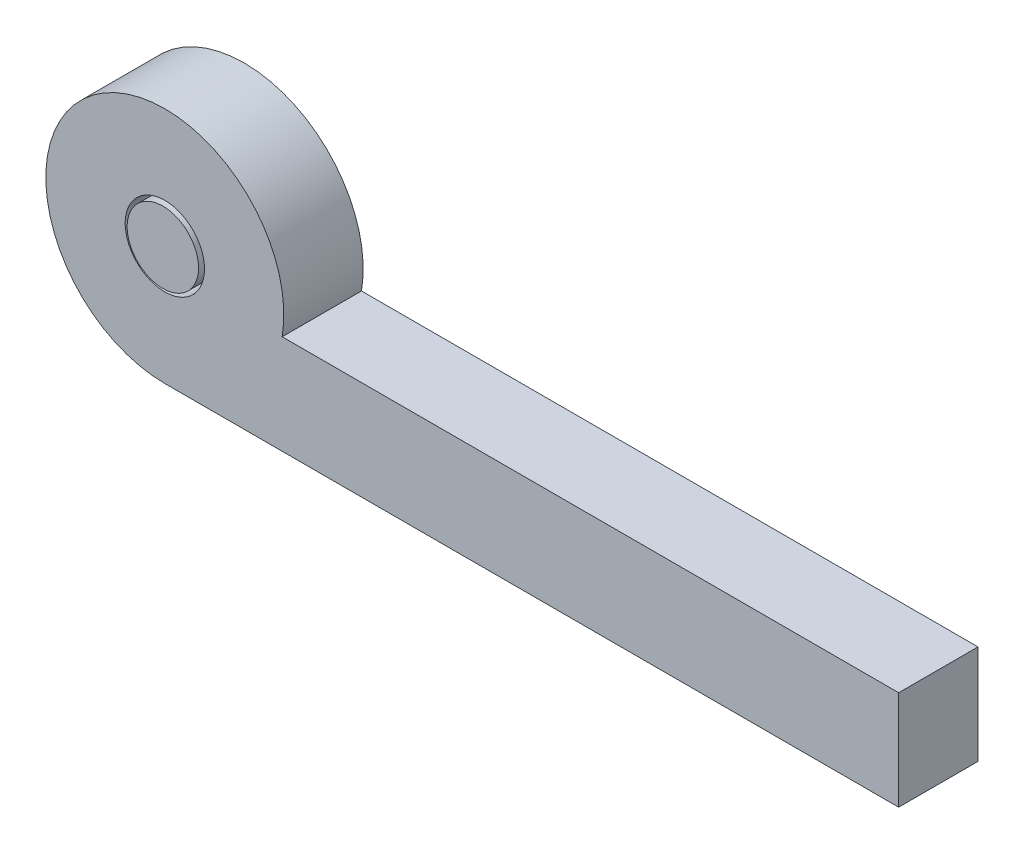
ISO-10303-21;
HEADER;
FILE_DESCRIPTION(('STEP AP214'),'2;1');
FILE_NAME('part.step','',(''),(''),'','','');
FILE_SCHEMA(('AUTOMOTIVE_DESIGN { 1 0 10303 214 1 1 1 1 }'));
ENDSEC;
DATA;
#1=APPLICATION_CONTEXT('core data for automotive mechanical design processes');
#2=APPLICATION_PROTOCOL_DEFINITION('international standard','automotive_design',2000,#1);
#3=PRODUCT_CONTEXT('',#1,'mechanical');
#4=PRODUCT('Part','Part','',(#3));
#5=PRODUCT_RELATED_PRODUCT_CATEGORY('part','',(#4));
#6=PRODUCT_DEFINITION_FORMATION('','',#4);
#7=PRODUCT_DEFINITION_CONTEXT('part definition',#1,'design');
#8=PRODUCT_DEFINITION('design','',#6,#7);
#9=PRODUCT_DEFINITION_SHAPE('','',#8);
#10=(LENGTH_UNIT() NAMED_UNIT(*) SI_UNIT(.MILLI.,.METRE.));
#11=(NAMED_UNIT(*) PLANE_ANGLE_UNIT() SI_UNIT($,.RADIAN.));
#12=(NAMED_UNIT(*) SI_UNIT($,.STERADIAN.) SOLID_ANGLE_UNIT());
#13=UNCERTAINTY_MEASURE_WITH_UNIT(LENGTH_MEASURE(1.E-05),#10,'distance_accuracy_value','');
#14=(GEOMETRIC_REPRESENTATION_CONTEXT(3) GLOBAL_UNCERTAINTY_ASSIGNED_CONTEXT((#13)) GLOBAL_UNIT_ASSIGNED_CONTEXT((#10,
#11,#12)) REPRESENTATION_CONTEXT('',''));
#15=CARTESIAN_POINT('',(0.,0.,0.));
#16=DIRECTION('',(0.,0.,1.));
#17=DIRECTION('',(1.,0.,0.));
#18=AXIS2_PLACEMENT_3D('',#15,#16,#17);
#19=CARTESIAN_POINT('',(-73.025,-41.275,-6.6675));
#20=DIRECTION('',(0.,0.,1.));
#21=DIRECTION('',(1.,0.,0.));
#22=AXIS2_PLACEMENT_3D('',#19,#20,#21);
#23=CYLINDRICAL_SURFACE('',#22,5.71499999999999);
#24=CARTESIAN_POINT('',(-73.025,-41.275,-6.6675));
#25=DIRECTION('',(0.,0.,1.));
#26=DIRECTION('',(1.,0.,0.));
#27=AXIS2_PLACEMENT_3D('',#24,#25,#26);
#28=CIRCLE('',#27,5.71499999999999);
#29=CARTESIAN_POINT('',(-67.31,-41.275,-6.6675));
#30=VERTEX_POINT('',#29);
#31=EDGE_CURVE('E11',#30,#30,#28,.T.);
#32=ORIENTED_EDGE('',*,*,#31,.T.);
#33=EDGE_LOOP('',(#32));
#34=FACE_BOUND('',#33,.T.);
#35=CARTESIAN_POINT('',(-73.025,-41.275,6.6675));
#36=DIRECTION('',(0.,0.,1.));
#37=DIRECTION('',(1.,0.,0.));
#38=AXIS2_PLACEMENT_3D('',#35,#36,#37);
#39=CIRCLE('',#38,5.71499999999999);
#40=CARTESIAN_POINT('',(-67.31,-41.275,6.6675));
#41=VERTEX_POINT('',#40);
#42=EDGE_CURVE('E43',#41,#41,#39,.T.);
#43=ORIENTED_EDGE('',*,*,#42,.F.);
#44=EDGE_LOOP('',(#43));
#45=FACE_BOUND('',#44,.T.);
#46=ADVANCED_FACE('F40',(#34,#45),#23,.T.);
#47=CARTESIAN_POINT('',(-73.025,-41.275,-6.6675));
#48=DIRECTION('',(0.,0.,1.));
#49=DIRECTION('',(1.,0.,0.));
#50=AXIS2_PLACEMENT_3D('',#47,#48,#49);
#51=PLANE('',#50);
#52=ORIENTED_EDGE('',*,*,#31,.F.);
#53=EDGE_LOOP('',(#52));
#54=FACE_BOUND('',#53,.T.);
#55=ADVANCED_FACE('F55',(#54),#51,.F.);
#56=CARTESIAN_POINT('',(-73.025,-41.275,6.6675));
#57=DIRECTION('',(0.,0.,1.));
#58=DIRECTION('',(1.,0.,0.));
#59=AXIS2_PLACEMENT_3D('',#56,#57,#58);
#60=PLANE('',#59);
#61=ORIENTED_EDGE('',*,*,#42,.T.);
#62=EDGE_LOOP('',(#61));
#63=FACE_BOUND('',#62,.T.);
#64=ADVANCED_FACE('F52',(#63),#60,.T.);
#65=CLOSED_SHELL('',(#46,#55,#64));
#66=MANIFOLD_SOLID_BREP('B2',#65);
#67=CARTESIAN_POINT('',(-73.025,-41.275,6.35));
#68=DIRECTION('',(0.,0.,-1.));
#69=DIRECTION('',(-1.,0.,0.));
#70=AXIS2_PLACEMENT_3D('',#67,#68,#69);
#71=CYLINDRICAL_SURFACE('',#70,19.05);
#72=CARTESIAN_POINT('',(-73.025,-41.275,6.35));
#73=DIRECTION('',(0.,0.,1.));
#74=DIRECTION('',(1.,0.,0.));
#75=AXIS2_PLACEMENT_3D('',#72,#73,#74);
#76=CIRCLE('',#75,19.05);
#77=CARTESIAN_POINT('',(-54.2414466886587,-44.45,6.35));
#78=VERTEX_POINT('',#77);
#79=CARTESIAN_POINT('',(-73.025,-60.3250000000001,6.35));
#80=VERTEX_POINT('',#79);
#81=EDGE_CURVE('E38',#78,#80,#76,.T.);
#82=ORIENTED_EDGE('',*,*,#81,.F.);
#83=DIRECTION('',(0.,0.,1.));
#84=VECTOR('',#83,1.);
#85=CARTESIAN_POINT('',(-54.2414466886587,-44.45,-124.892782361475));
#86=LINE('',#85,#84);
#87=CARTESIAN_POINT('',(-54.2414466886587,-44.45,-6.34999999999999));
#88=VERTEX_POINT('',#87);
#89=EDGE_CURVE('E149',#88,#78,#86,.T.);
#90=ORIENTED_EDGE('',*,*,#89,.F.);
#91=CARTESIAN_POINT('',(-73.025,-41.275,-6.35));
#92=DIRECTION('',(0.,0.,1.));
#93=DIRECTION('',(1.,0.,0.));
#94=AXIS2_PLACEMENT_3D('',#91,#92,#93);
#95=CIRCLE('',#94,19.05);
#96=CARTESIAN_POINT('',(-73.025,-60.3250000000001,-6.35));
#97=VERTEX_POINT('',#96);
#98=EDGE_CURVE('E83',#88,#97,#95,.T.);
#99=ORIENTED_EDGE('',*,*,#98,.T.);
#100=DIRECTION('',(0.,0.,1.));
#101=VECTOR('',#100,1.);
#102=CARTESIAN_POINT('',(-73.025,-60.3250000000001,-124.892782361475));
#103=LINE('',#102,#101);
#104=EDGE_CURVE('E97',#97,#80,#103,.T.);
#105=ORIENTED_EDGE('',*,*,#104,.T.);
#106=EDGE_LOOP('',(#82,#90,#99,#105));
#107=FACE_BOUND('',#106,.T.);
#108=ADVANCED_FACE('F80',(#107),#71,.T.);
#109=CARTESIAN_POINT('',(-73.025,-41.275,6.35));
#110=DIRECTION('',(0.,0.,1.));
#111=DIRECTION('',(1.,0.,0.));
#112=AXIS2_PLACEMENT_3D('',#109,#110,#111);
#113=PLANE('',#112);
#114=CARTESIAN_POINT('',(-73.025,-41.275,6.35));
#115=DIRECTION('',(0.,0.,1.));
#116=DIRECTION('',(1.,0.,0.));
#117=AXIS2_PLACEMENT_3D('',#114,#115,#116);
#118=CIRCLE('',#117,6.35);
#119=CARTESIAN_POINT('',(-66.675,-41.275,6.35));
#120=VERTEX_POINT('',#119);
#121=EDGE_CURVE('E142',#120,#120,#118,.T.);
#122=ORIENTED_EDGE('',*,*,#121,.F.);
#123=EDGE_LOOP('',(#122));
#124=FACE_BOUND('',#123,.T.);
#125=ORIENTED_EDGE('',*,*,#81,.T.);
#126=DIRECTION('',(1.,0.,0.));
#127=VECTOR('',#126,1.);
#128=CARTESIAN_POINT('',(44.45,-60.325,6.35));
#129=LINE('',#128,#127);
#130=CARTESIAN_POINT('',(44.45,-60.325,6.35));
#131=VERTEX_POINT('',#130);
#132=EDGE_CURVE('E122',#80,#131,#129,.T.);
#133=ORIENTED_EDGE('',*,*,#132,.T.);
#134=DIRECTION('',(0.,1.,0.));
#135=VECTOR('',#134,1.);
#136=CARTESIAN_POINT('',(44.45,-44.45,6.35));
#137=LINE('',#136,#135);
#138=CARTESIAN_POINT('',(44.45,-44.45,6.35));
#139=VERTEX_POINT('',#138);
#140=EDGE_CURVE('E130',#131,#139,#137,.T.);
#141=ORIENTED_EDGE('',*,*,#140,.T.);
#142=DIRECTION('',(-1.,0.,0.));
#143=VECTOR('',#142,1.);
#144=CARTESIAN_POINT('',(-54.2414466886587,-44.45,6.35));
#145=LINE('',#144,#143);
#146=EDGE_CURVE('E136',#139,#78,#145,.T.);
#147=ORIENTED_EDGE('',*,*,#146,.T.);
#148=EDGE_LOOP('',(#125,#133,#141,#147));
#149=FACE_BOUND('',#148,.T.);
#150=ADVANCED_FACE('F138',(#124,#149),#113,.T.);
#151=CARTESIAN_POINT('',(-73.025,-41.275,-6.35));
#152=DIRECTION('',(0.,0.,1.));
#153=DIRECTION('',(1.,0.,0.));
#154=AXIS2_PLACEMENT_3D('',#151,#152,#153);
#155=PLANE('',#154);
#156=CARTESIAN_POINT('',(-73.025,-41.275,-6.35));
#157=DIRECTION('',(0.,0.,1.));
#158=DIRECTION('',(1.,0.,0.));
#159=AXIS2_PLACEMENT_3D('',#156,#157,#158);
#160=CIRCLE('',#159,6.35);
#161=CARTESIAN_POINT('',(-66.675,-41.275,-6.35));
#162=VERTEX_POINT('',#161);
#163=EDGE_CURVE('E139',#162,#162,#160,.T.);
#164=ORIENTED_EDGE('',*,*,#163,.T.);
#165=EDGE_LOOP('',(#164));
#166=FACE_BOUND('',#165,.T.);
#167=ORIENTED_EDGE('',*,*,#98,.F.);
#168=DIRECTION('',(1.,0.,0.));
#169=VECTOR('',#168,1.);
#170=CARTESIAN_POINT('',(-54.2414466886587,-44.45,-6.34999999999999));
#171=LINE('',#170,#169);
#172=CARTESIAN_POINT('',(44.45,-44.45,-6.34999999999999));
#173=VERTEX_POINT('',#172);
#174=EDGE_CURVE('E145',#88,#173,#171,.T.);
#175=ORIENTED_EDGE('',*,*,#174,.T.);
#176=DIRECTION('',(0.,-1.,0.));
#177=VECTOR('',#176,1.);
#178=CARTESIAN_POINT('',(44.45,-44.45,-6.34999999999999));
#179=LINE('',#178,#177);
#180=CARTESIAN_POINT('',(44.45,-60.325,-6.34999999999999));
#181=VERTEX_POINT('',#180);
#182=EDGE_CURVE('E151',#173,#181,#179,.T.);
#183=ORIENTED_EDGE('',*,*,#182,.T.);
#184=DIRECTION('',(-1.,0.,0.));
#185=VECTOR('',#184,1.);
#186=CARTESIAN_POINT('',(44.45,-60.325,-6.34999999999999));
#187=LINE('',#186,#185);
#188=EDGE_CURVE('E124',#181,#97,#187,.T.);
#189=ORIENTED_EDGE('',*,*,#188,.T.);
#190=EDGE_LOOP('',(#167,#175,#183,#189));
#191=FACE_BOUND('',#190,.T.);
#192=ADVANCED_FACE('F163',(#166,#191),#155,.F.);
#193=CARTESIAN_POINT('',(-54.2414466886587,-44.45,-124.892782361475));
#194=DIRECTION('',(0.,1.,0.));
#195=DIRECTION('',(-1.,0.,0.));
#196=AXIS2_PLACEMENT_3D('',#193,#194,#195);
#197=PLANE('',#196);
#198=ORIENTED_EDGE('',*,*,#174,.F.);
#199=ORIENTED_EDGE('',*,*,#89,.T.);
#200=ORIENTED_EDGE('',*,*,#146,.F.);
#201=DIRECTION('',(0.,0.,1.));
#202=VECTOR('',#201,1.);
#203=CARTESIAN_POINT('',(44.45,-44.45,-124.892782361475));
#204=LINE('',#203,#202);
#205=EDGE_CURVE('E127',#173,#139,#204,.T.);
#206=ORIENTED_EDGE('',*,*,#205,.F.);
#207=EDGE_LOOP('',(#198,#199,#200,#206));
#208=FACE_BOUND('',#207,.T.);
#209=ADVANCED_FACE('F169',(#208),#197,.T.);
#210=CARTESIAN_POINT('',(44.45,-44.45,-124.892782361475));
#211=DIRECTION('',(1.,0.,0.));
#212=DIRECTION('',(0.,0.,-1.));
#213=AXIS2_PLACEMENT_3D('',#210,#211,#212);
#214=PLANE('',#213);
#215=ORIENTED_EDGE('',*,*,#182,.F.);
#216=ORIENTED_EDGE('',*,*,#205,.T.);
#217=ORIENTED_EDGE('',*,*,#140,.F.);
#218=DIRECTION('',(0.,0.,1.));
#219=VECTOR('',#218,1.);
#220=CARTESIAN_POINT('',(44.45,-60.325,-124.892782361475));
#221=LINE('',#220,#219);
#222=EDGE_CURVE('E118',#181,#131,#221,.T.);
#223=ORIENTED_EDGE('',*,*,#222,.F.);
#224=EDGE_LOOP('',(#215,#216,#217,#223));
#225=FACE_BOUND('',#224,.T.);
#226=ADVANCED_FACE('F131',(#225),#214,.T.);
#227=CARTESIAN_POINT('',(44.45,-60.325,-124.892782361475));
#228=DIRECTION('',(0.,-1.,0.));
#229=DIRECTION('',(1.,0.,0.));
#230=AXIS2_PLACEMENT_3D('',#227,#228,#229);
#231=PLANE('',#230);
#232=ORIENTED_EDGE('',*,*,#188,.F.);
#233=ORIENTED_EDGE('',*,*,#222,.T.);
#234=ORIENTED_EDGE('',*,*,#132,.F.);
#235=ORIENTED_EDGE('',*,*,#104,.F.);
#236=EDGE_LOOP('',(#232,#233,#234,#235));
#237=FACE_BOUND('',#236,.T.);
#238=ADVANCED_FACE('F120',(#237),#231,.T.);
#239=CARTESIAN_POINT('',(-73.025,-41.275,-6.35));
#240=DIRECTION('',(0.,0.,1.));
#241=DIRECTION('',(1.,0.,0.));
#242=AXIS2_PLACEMENT_3D('',#239,#240,#241);
#243=CYLINDRICAL_SURFACE('',#242,6.35);
#244=ORIENTED_EDGE('',*,*,#163,.F.);
#245=EDGE_LOOP('',(#244));
#246=FACE_BOUND('',#245,.T.);
#247=ORIENTED_EDGE('',*,*,#121,.T.);
#248=EDGE_LOOP('',(#247));
#249=FACE_BOUND('',#248,.T.);
#250=ADVANCED_FACE('F160',(#246,#249),#243,.F.);
#251=CLOSED_SHELL('',(#108,#150,#192,#209,#226,#238,#250));
#252=MANIFOLD_SOLID_BREP('B6',#251);
#253=ADVANCED_BREP_SHAPE_REPRESENTATION('',(#18,#66,#252),#14);
#254=SHAPE_DEFINITION_REPRESENTATION(#9,#253);
ENDSEC;
END-ISO-10303-21;
